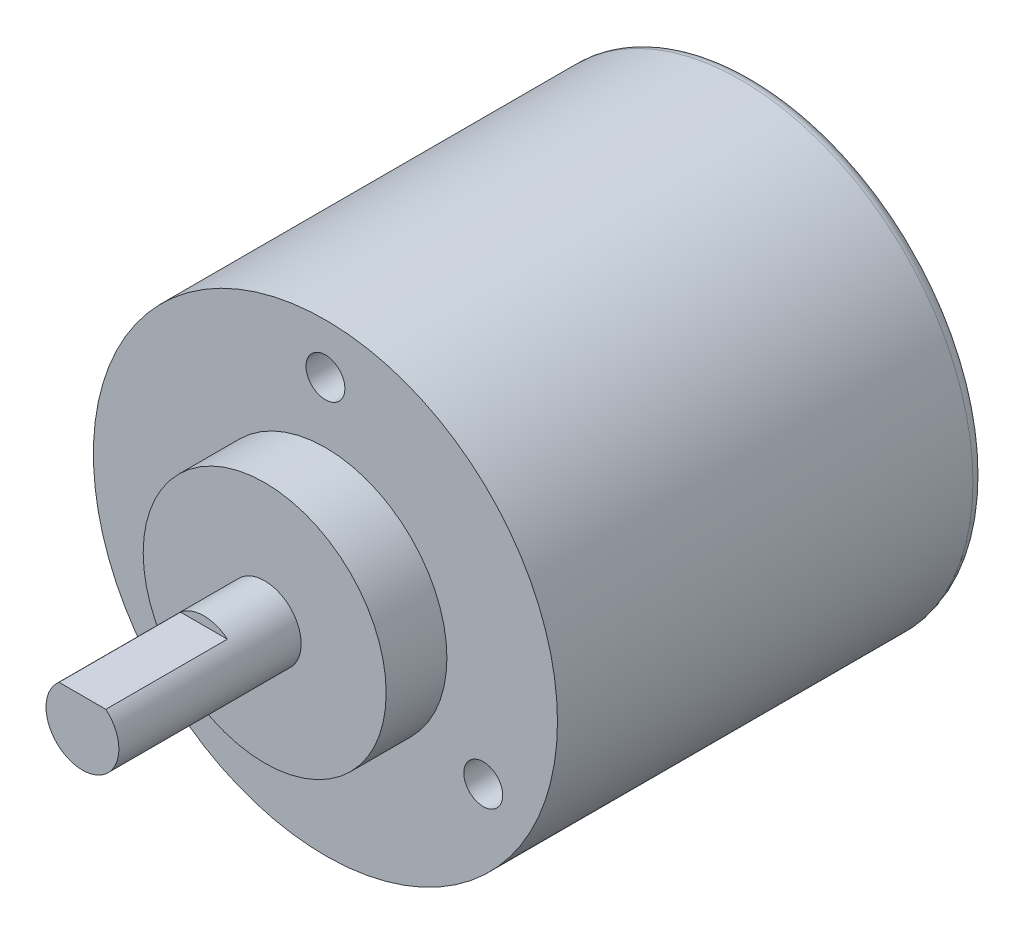
ISO-10303-21;
HEADER;
FILE_DESCRIPTION(('STEP AP214'),'2;1');
FILE_NAME('part.step','',(''),(''),'','','');
FILE_SCHEMA(('AUTOMOTIVE_DESIGN { 1 0 10303 214 1 1 1 1 }'));
ENDSEC;
DATA;
#1=APPLICATION_CONTEXT('core data for automotive mechanical design processes');
#2=APPLICATION_PROTOCOL_DEFINITION('international standard','automotive_design',2000,#1);
#3=PRODUCT_CONTEXT('',#1,'mechanical');
#4=PRODUCT('Part','Part','',(#3));
#5=PRODUCT_RELATED_PRODUCT_CATEGORY('part','',(#4));
#6=PRODUCT_DEFINITION_FORMATION('','',#4);
#7=PRODUCT_DEFINITION_CONTEXT('part definition',#1,'design');
#8=PRODUCT_DEFINITION('design','',#6,#7);
#9=PRODUCT_DEFINITION_SHAPE('','',#8);
#10=(LENGTH_UNIT() NAMED_UNIT(*) SI_UNIT(.MILLI.,.METRE.));
#11=(NAMED_UNIT(*) PLANE_ANGLE_UNIT() SI_UNIT($,.RADIAN.));
#12=(NAMED_UNIT(*) SI_UNIT($,.STERADIAN.) SOLID_ANGLE_UNIT());
#13=UNCERTAINTY_MEASURE_WITH_UNIT(LENGTH_MEASURE(1.E-05),#10,'distance_accuracy_value','');
#14=(GEOMETRIC_REPRESENTATION_CONTEXT(3) GLOBAL_UNCERTAINTY_ASSIGNED_CONTEXT((#13)) GLOBAL_UNIT_ASSIGNED_CONTEXT((#10,
#11,#12)) REPRESENTATION_CONTEXT('',''));
#15=CARTESIAN_POINT('',(0.,0.,0.));
#16=DIRECTION('',(0.,0.,1.));
#17=DIRECTION('',(1.,0.,0.));
#18=AXIS2_PLACEMENT_3D('',#15,#16,#17);
#19=CARTESIAN_POINT('',(0.,0.,35.2));
#20=DIRECTION('',(0.,0.,-1.));
#21=DIRECTION('',(-1.,0.,0.));
#22=AXIS2_PLACEMENT_3D('',#19,#20,#21);
#23=CYLINDRICAL_SURFACE('',#22,19.1);
#24=CARTESIAN_POINT('',(0.,0.,1.));
#25=DIRECTION('',(0.,0.,1.));
#26=DIRECTION('',(1.,0.,0.));
#27=AXIS2_PLACEMENT_3D('',#24,#25,#26);
#28=CIRCLE('',#27,19.1);
#29=CARTESIAN_POINT('',(19.1,0.,1.));
#30=VERTEX_POINT('',#29);
#31=EDGE_CURVE('E43',#30,#30,#28,.T.);
#32=ORIENTED_EDGE('',*,*,#31,.T.);
#33=EDGE_LOOP('',(#32));
#34=FACE_BOUND('',#33,.T.);
#35=CARTESIAN_POINT('',(0.,0.,35.2));
#36=DIRECTION('',(0.,0.,1.));
#37=DIRECTION('',(1.,0.,0.));
#38=AXIS2_PLACEMENT_3D('',#35,#36,#37);
#39=CIRCLE('',#38,19.1);
#40=CARTESIAN_POINT('',(19.1,0.,35.2));
#41=VERTEX_POINT('',#40);
#42=EDGE_CURVE('E103',#41,#41,#39,.T.);
#43=ORIENTED_EDGE('',*,*,#42,.F.);
#44=EDGE_LOOP('',(#43));
#45=FACE_BOUND('',#44,.T.);
#46=ADVANCED_FACE('F35',(#34,#45),#23,.T.);
#47=CARTESIAN_POINT('',(0.,0.,35.2));
#48=DIRECTION('',(0.,0.,1.));
#49=DIRECTION('',(1.,0.,0.));
#50=AXIS2_PLACEMENT_3D('',#47,#48,#49);
#51=PLANE('',#50);
#52=CARTESIAN_POINT('',(0.,15.,35.2));
#53=DIRECTION('',(0.,0.,1.));
#54=DIRECTION('',(1.,0.,0.));
#55=AXIS2_PLACEMENT_3D('',#52,#53,#54);
#56=CIRCLE('',#55,1.6);
#57=CARTESIAN_POINT('',(1.6,15.,35.2));
#58=VERTEX_POINT('',#57);
#59=EDGE_CURVE('E90',#58,#58,#56,.T.);
#60=ORIENTED_EDGE('',*,*,#59,.F.);
#61=EDGE_LOOP('',(#60));
#62=FACE_BOUND('',#61,.T.);
#63=CARTESIAN_POINT('',(12.9903810567672,-7.49999999999963,35.2));
#64=DIRECTION('',(0.,0.,1.));
#65=DIRECTION('',(1.,0.,0.));
#66=AXIS2_PLACEMENT_3D('',#63,#64,#65);
#67=CIRCLE('',#66,1.60000000000057);
#68=CARTESIAN_POINT('',(14.5903810567678,-7.49999999999963,35.2));
#69=VERTEX_POINT('',#68);
#70=EDGE_CURVE('E96',#69,#69,#67,.T.);
#71=ORIENTED_EDGE('',*,*,#70,.F.);
#72=EDGE_LOOP('',(#71));
#73=FACE_BOUND('',#72,.T.);
#74=CARTESIAN_POINT('',(-12.9903810567659,-7.50000000000037,35.2));
#75=DIRECTION('',(0.,0.,1.));
#76=DIRECTION('',(1.,0.,0.));
#77=AXIS2_PLACEMENT_3D('',#74,#75,#76);
#78=CIRCLE('',#77,1.60000000000086);
#79=CARTESIAN_POINT('',(-11.3903810567651,-7.50000000000037,35.2));
#80=VERTEX_POINT('',#79);
#81=EDGE_CURVE('E75',#80,#80,#78,.T.);
#82=ORIENTED_EDGE('',*,*,#81,.F.);
#83=EDGE_LOOP('',(#82));
#84=FACE_BOUND('',#83,.T.);
#85=CARTESIAN_POINT('',(0.,0.,35.2));
#86=DIRECTION('',(0.,0.,1.));
#87=DIRECTION('',(1.,0.,0.));
#88=AXIS2_PLACEMENT_3D('',#85,#86,#87);
#89=CIRCLE('',#88,10.);
#90=CARTESIAN_POINT('',(10.,0.,35.2));
#91=VERTEX_POINT('',#90);
#92=EDGE_CURVE('E85',#91,#91,#89,.T.);
#93=ORIENTED_EDGE('',*,*,#92,.F.);
#94=EDGE_LOOP('',(#93));
#95=FACE_BOUND('',#94,.T.);
#96=ORIENTED_EDGE('',*,*,#42,.T.);
#97=EDGE_LOOP('',(#96));
#98=FACE_BOUND('',#97,.T.);
#99=ADVANCED_FACE('F122',(#62,#73,#84,#95,#98),#51,.T.);
#100=CARTESIAN_POINT('',(0.,0.,0.));
#101=DIRECTION('',(0.,0.,1.));
#102=DIRECTION('',(1.,0.,0.));
#103=AXIS2_PLACEMENT_3D('',#100,#101,#102);
#104=PLANE('',#103);
#105=CARTESIAN_POINT('',(0.,0.,0.));
#106=DIRECTION('',(0.,0.,1.));
#107=DIRECTION('',(1.,0.,0.));
#108=AXIS2_PLACEMENT_3D('',#105,#106,#107);
#109=CIRCLE('',#108,18.1);
#110=CARTESIAN_POINT('',(18.1,0.,0.));
#111=VERTEX_POINT('',#110);
#112=EDGE_CURVE('E11',#111,#111,#109,.F.);
#113=ORIENTED_EDGE('',*,*,#112,.T.);
#114=EDGE_LOOP('',(#113));
#115=FACE_BOUND('',#114,.T.);
#116=ADVANCED_FACE('F126',(#115),#104,.F.);
#117=CARTESIAN_POINT('',(0.,0.,40.2));
#118=DIRECTION('',(0.,0.,-1.));
#119=DIRECTION('',(-1.,0.,0.));
#120=AXIS2_PLACEMENT_3D('',#117,#118,#119);
#121=CYLINDRICAL_SURFACE('',#120,10.);
#122=CARTESIAN_POINT('',(0.,0.,40.2));
#123=DIRECTION('',(0.,0.,1.));
#124=DIRECTION('',(1.,0.,0.));
#125=AXIS2_PLACEMENT_3D('',#122,#123,#124);
#126=CIRCLE('',#125,10.);
#127=CARTESIAN_POINT('',(10.,0.,40.2));
#128=VERTEX_POINT('',#127);
#129=EDGE_CURVE('E89',#128,#128,#126,.T.);
#130=ORIENTED_EDGE('',*,*,#129,.F.);
#131=EDGE_LOOP('',(#130));
#132=FACE_BOUND('',#131,.T.);
#133=ORIENTED_EDGE('',*,*,#92,.T.);
#134=EDGE_LOOP('',(#133));
#135=FACE_BOUND('',#134,.T.);
#136=ADVANCED_FACE('F131',(#132,#135),#121,.T.);
#137=CARTESIAN_POINT('',(0.,0.,40.2));
#138=DIRECTION('',(0.,0.,1.));
#139=DIRECTION('',(1.,0.,0.));
#140=AXIS2_PLACEMENT_3D('',#137,#138,#139);
#141=PLANE('',#140);
#142=CARTESIAN_POINT('',(0.,0.,40.2));
#143=DIRECTION('',(0.,0.,1.));
#144=DIRECTION('',(1.,0.,0.));
#145=AXIS2_PLACEMENT_3D('',#142,#143,#144);
#146=CIRCLE('',#145,3.);
#147=CARTESIAN_POINT('',(3.,0.,40.2));
#148=VERTEX_POINT('',#147);
#149=EDGE_CURVE('E82',#148,#148,#146,.T.);
#150=ORIENTED_EDGE('',*,*,#149,.F.);
#151=EDGE_LOOP('',(#150));
#152=FACE_BOUND('',#151,.T.);
#153=ORIENTED_EDGE('',*,*,#129,.T.);
#154=EDGE_LOOP('',(#153));
#155=FACE_BOUND('',#154,.T.);
#156=ADVANCED_FACE('F136',(#152,#155),#141,.T.);
#157=CARTESIAN_POINT('',(-12.9903810567659,-7.50000000000037,30.2));
#158=DIRECTION('',(0.,0.,1.));
#159=DIRECTION('',(1.,0.,0.));
#160=AXIS2_PLACEMENT_3D('',#157,#158,#159);
#161=CYLINDRICAL_SURFACE('',#160,1.60000000000086);
#162=CARTESIAN_POINT('',(-12.9903810567659,-7.50000000000037,30.2));
#163=DIRECTION('',(0.,0.,1.));
#164=DIRECTION('',(1.,0.,0.));
#165=AXIS2_PLACEMENT_3D('',#162,#163,#164);
#166=CIRCLE('',#165,1.60000000000086);
#167=CARTESIAN_POINT('',(-11.3903810567651,-7.50000000000037,30.2));
#168=VERTEX_POINT('',#167);
#169=EDGE_CURVE('E78',#168,#168,#166,.T.);
#170=ORIENTED_EDGE('',*,*,#169,.F.);
#171=EDGE_LOOP('',(#170));
#172=FACE_BOUND('',#171,.T.);
#173=ORIENTED_EDGE('',*,*,#81,.T.);
#174=EDGE_LOOP('',(#173));
#175=FACE_BOUND('',#174,.T.);
#176=ADVANCED_FACE('F140',(#172,#175),#161,.F.);
#177=CARTESIAN_POINT('',(-12.9903810567659,-7.50000000000037,30.2));
#178=DIRECTION('',(0.,0.,1.));
#179=DIRECTION('',(1.,0.,0.));
#180=AXIS2_PLACEMENT_3D('',#177,#178,#179);
#181=PLANE('',#180);
#182=ORIENTED_EDGE('',*,*,#169,.T.);
#183=EDGE_LOOP('',(#182));
#184=FACE_BOUND('',#183,.T.);
#185=ADVANCED_FACE('F144',(#184),#181,.T.);
#186=CARTESIAN_POINT('',(12.9903810567672,-7.49999999999963,30.2));
#187=DIRECTION('',(0.,0.,1.));
#188=DIRECTION('',(1.,0.,0.));
#189=AXIS2_PLACEMENT_3D('',#186,#187,#188);
#190=CYLINDRICAL_SURFACE('',#189,1.60000000000057);
#191=CARTESIAN_POINT('',(12.9903810567672,-7.49999999999963,30.2));
#192=DIRECTION('',(0.,0.,1.));
#193=DIRECTION('',(1.,0.,0.));
#194=AXIS2_PLACEMENT_3D('',#191,#192,#193);
#195=CIRCLE('',#194,1.60000000000057);
#196=CARTESIAN_POINT('',(14.5903810567678,-7.49999999999963,30.2));
#197=VERTEX_POINT('',#196);
#198=EDGE_CURVE('E93',#197,#197,#195,.T.);
#199=ORIENTED_EDGE('',*,*,#198,.F.);
#200=EDGE_LOOP('',(#199));
#201=FACE_BOUND('',#200,.T.);
#202=ORIENTED_EDGE('',*,*,#70,.T.);
#203=EDGE_LOOP('',(#202));
#204=FACE_BOUND('',#203,.T.);
#205=ADVANCED_FACE('F148',(#201,#204),#190,.F.);
#206=CARTESIAN_POINT('',(12.9903810567672,-7.49999999999963,30.2));
#207=DIRECTION('',(0.,0.,1.));
#208=DIRECTION('',(1.,0.,0.));
#209=AXIS2_PLACEMENT_3D('',#206,#207,#208);
#210=PLANE('',#209);
#211=ORIENTED_EDGE('',*,*,#198,.T.);
#212=EDGE_LOOP('',(#211));
#213=FACE_BOUND('',#212,.T.);
#214=ADVANCED_FACE('F152',(#213),#210,.T.);
#215=CARTESIAN_POINT('',(0.,15.,30.2));
#216=DIRECTION('',(0.,0.,1.));
#217=DIRECTION('',(1.,0.,0.));
#218=AXIS2_PLACEMENT_3D('',#215,#216,#217);
#219=CYLINDRICAL_SURFACE('',#218,1.6);
#220=CARTESIAN_POINT('',(0.,15.,30.2));
#221=DIRECTION('',(0.,0.,1.));
#222=DIRECTION('',(1.,0.,0.));
#223=AXIS2_PLACEMENT_3D('',#220,#221,#222);
#224=CIRCLE('',#223,1.6);
#225=CARTESIAN_POINT('',(1.6,15.,30.2));
#226=VERTEX_POINT('',#225);
#227=EDGE_CURVE('E86',#226,#226,#224,.T.);
#228=ORIENTED_EDGE('',*,*,#227,.F.);
#229=EDGE_LOOP('',(#228));
#230=FACE_BOUND('',#229,.T.);
#231=ORIENTED_EDGE('',*,*,#59,.T.);
#232=EDGE_LOOP('',(#231));
#233=FACE_BOUND('',#232,.T.);
#234=ADVANCED_FACE('F156',(#230,#233),#219,.F.);
#235=CARTESIAN_POINT('',(0.,15.,30.2));
#236=DIRECTION('',(0.,0.,1.));
#237=DIRECTION('',(1.,0.,0.));
#238=AXIS2_PLACEMENT_3D('',#235,#236,#237);
#239=PLANE('',#238);
#240=ORIENTED_EDGE('',*,*,#227,.T.);
#241=EDGE_LOOP('',(#240));
#242=FACE_BOUND('',#241,.T.);
#243=ADVANCED_FACE('F160',(#242),#239,.T.);
#244=CARTESIAN_POINT('',(0.,0.,55.2));
#245=DIRECTION('',(0.,0.,-1.));
#246=DIRECTION('',(-1.,0.,0.));
#247=AXIS2_PLACEMENT_3D('',#244,#245,#246);
#248=CYLINDRICAL_SURFACE('',#247,3.);
#249=CARTESIAN_POINT('',(0.,0.,55.2));
#250=DIRECTION('',(0.,0.,1.));
#251=DIRECTION('',(1.,0.,0.));
#252=AXIS2_PLACEMENT_3D('',#249,#250,#251);
#253=CIRCLE('',#252,3.);
#254=CARTESIAN_POINT('',(-1.92613602842582,2.3,55.2));
#255=VERTEX_POINT('',#254);
#256=CARTESIAN_POINT('',(1.92613602842582,2.3,55.2));
#257=VERTEX_POINT('',#256);
#258=EDGE_CURVE('E72',#255,#257,#253,.T.);
#259=ORIENTED_EDGE('',*,*,#258,.F.);
#260=DIRECTION('',(0.,0.,1.));
#261=VECTOR('',#260,1.);
#262=CARTESIAN_POINT('',(-1.92613602842582,2.3,45.2));
#263=LINE('',#262,#261);
#264=CARTESIAN_POINT('',(-1.92613602842582,2.3,45.2));
#265=VERTEX_POINT('',#264);
#266=EDGE_CURVE('E50',#265,#255,#263,.T.);
#267=ORIENTED_EDGE('',*,*,#266,.F.);
#268=CARTESIAN_POINT('',(0.,0.,45.2));
#269=DIRECTION('',(0.,0.,1.));
#270=DIRECTION('',(1.,0.,0.));
#271=AXIS2_PLACEMENT_3D('',#268,#269,#270);
#272=CIRCLE('',#271,3.);
#273=CARTESIAN_POINT('',(1.92613602842582,2.3,45.2));
#274=VERTEX_POINT('',#273);
#275=EDGE_CURVE('E66',#274,#265,#272,.T.);
#276=ORIENTED_EDGE('',*,*,#275,.F.);
#277=DIRECTION('',(0.,0.,1.));
#278=VECTOR('',#277,1.);
#279=CARTESIAN_POINT('',(1.92613602842582,2.3,45.2));
#280=LINE('',#279,#278);
#281=EDGE_CURVE('E56',#274,#257,#280,.T.);
#282=ORIENTED_EDGE('',*,*,#281,.T.);
#283=EDGE_LOOP('',(#259,#267,#276,#282));
#284=FACE_BOUND('',#283,.T.);
#285=ORIENTED_EDGE('',*,*,#149,.T.);
#286=EDGE_LOOP('',(#285));
#287=FACE_BOUND('',#286,.T.);
#288=ADVANCED_FACE('F70',(#284,#287),#248,.T.);
#289=CARTESIAN_POINT('',(0.,0.,55.2));
#290=DIRECTION('',(0.,0.,1.));
#291=DIRECTION('',(1.,0.,0.));
#292=AXIS2_PLACEMENT_3D('',#289,#290,#291);
#293=PLANE('',#292);
#294=DIRECTION('',(1.,0.,0.));
#295=VECTOR('',#294,1.);
#296=CARTESIAN_POINT('',(-1.92613602842582,2.3,55.2));
#297=LINE('',#296,#295);
#298=EDGE_CURVE('E61',#255,#257,#297,.T.);
#299=ORIENTED_EDGE('',*,*,#298,.F.);
#300=ORIENTED_EDGE('',*,*,#258,.T.);
#301=EDGE_LOOP('',(#299,#300));
#302=FACE_BOUND('',#301,.T.);
#303=ADVANCED_FACE('F74',(#302),#293,.T.);
#304=CARTESIAN_POINT('',(-1.92613602842582,2.3,45.2));
#305=DIRECTION('',(0.,-1.,0.));
#306=DIRECTION('',(0.,0.,-1.));
#307=AXIS2_PLACEMENT_3D('',#304,#305,#306);
#308=PLANE('',#307);
#309=ORIENTED_EDGE('',*,*,#298,.T.);
#310=ORIENTED_EDGE('',*,*,#281,.F.);
#311=DIRECTION('',(1.,0.,0.));
#312=VECTOR('',#311,1.);
#313=CARTESIAN_POINT('',(-1.92613602842582,2.3,45.2));
#314=LINE('',#313,#312);
#315=EDGE_CURVE('E281',#265,#274,#314,.T.);
#316=ORIENTED_EDGE('',*,*,#315,.F.);
#317=ORIENTED_EDGE('',*,*,#266,.T.);
#318=EDGE_LOOP('',(#309,#310,#316,#317));
#319=FACE_BOUND('',#318,.T.);
#320=ADVANCED_FACE('F62',(#319),#308,.F.);
#321=CARTESIAN_POINT('',(0.,0.,45.2));
#322=DIRECTION('',(0.,0.,1.));
#323=DIRECTION('',(1.,0.,0.));
#324=AXIS2_PLACEMENT_3D('',#321,#322,#323);
#325=PLANE('',#324);
#326=ORIENTED_EDGE('',*,*,#275,.T.);
#327=ORIENTED_EDGE('',*,*,#315,.T.);
#328=EDGE_LOOP('',(#326,#327));
#329=FACE_BOUND('',#328,.T.);
#330=ADVANCED_FACE('F113',(#329),#325,.T.);
#331=CARTESIAN_POINT('',(0.,0.,1.));
#332=DIRECTION('',(0.,0.,1.));
#333=DIRECTION('',(1.,0.,0.));
#334=AXIS2_PLACEMENT_3D('',#331,#332,#333);
#335=TOROIDAL_SURFACE('',#334,18.1,1.);
#336=ORIENTED_EDGE('',*,*,#112,.F.);
#337=EDGE_LOOP('',(#336));
#338=FACE_BOUND('',#337,.T.);
#339=ORIENTED_EDGE('',*,*,#31,.F.);
#340=EDGE_LOOP('',(#339));
#341=FACE_BOUND('',#340,.T.);
#342=ADVANCED_FACE('F37',(#338,#341),#335,.T.);
#343=CLOSED_SHELL('',(#46,#99,#116,#136,#156,#176,#185,#205,#214,#234,#243,#288,#303,#320,#330,#342));
#344=MANIFOLD_SOLID_BREP('B2',#343);
#345=ADVANCED_BREP_SHAPE_REPRESENTATION('',(#18,#344),#14);
#346=SHAPE_DEFINITION_REPRESENTATION(#9,#345);
ENDSEC;
END-ISO-10303-21;
